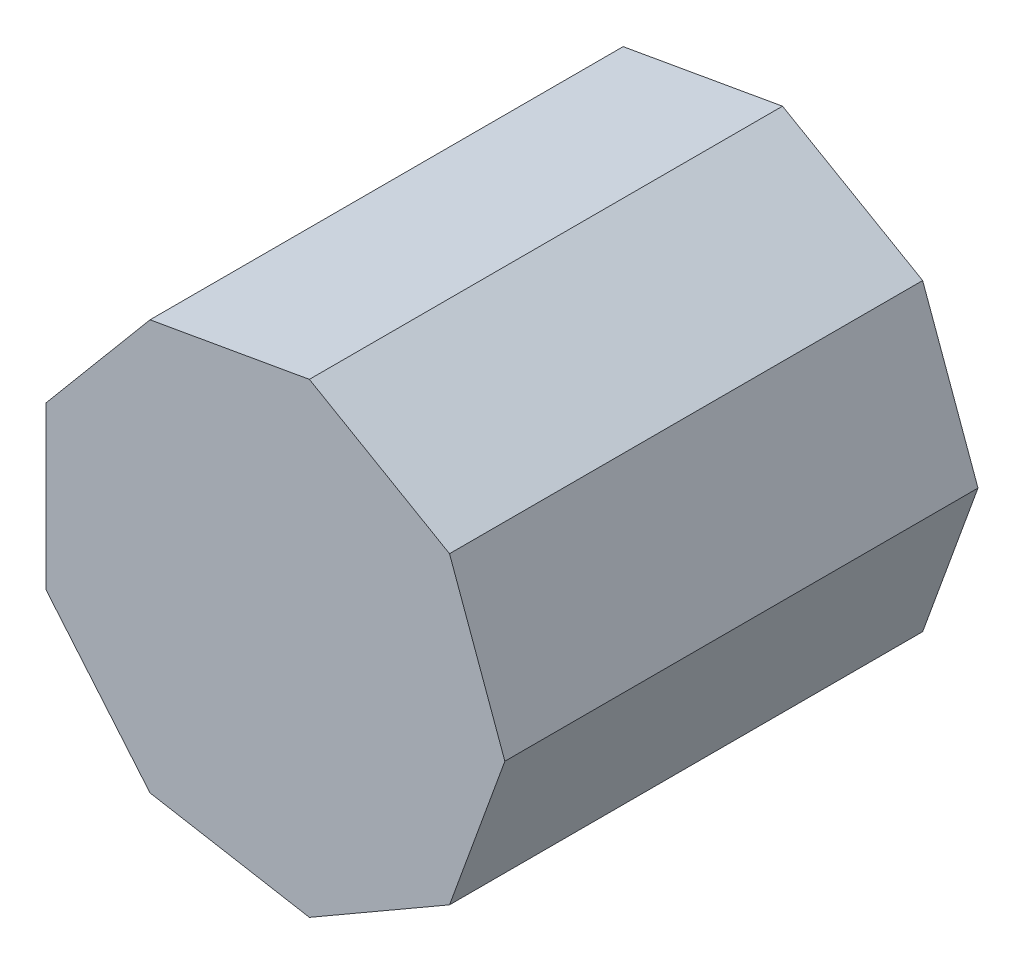
ISO-10303-21;
HEADER;
FILE_DESCRIPTION(('STEP AP214'),'2;1');
FILE_NAME('part.step','',(''),(''),'','','');
FILE_SCHEMA(('AUTOMOTIVE_DESIGN { 1 0 10303 214 1 1 1 1 }'));
ENDSEC;
DATA;
#1=APPLICATION_CONTEXT('core data for automotive mechanical design processes');
#2=APPLICATION_PROTOCOL_DEFINITION('international standard','automotive_design',2000,#1);
#3=PRODUCT_CONTEXT('',#1,'mechanical');
#4=PRODUCT('Part','Part','',(#3));
#5=PRODUCT_RELATED_PRODUCT_CATEGORY('part','',(#4));
#6=PRODUCT_DEFINITION_FORMATION('','',#4);
#7=PRODUCT_DEFINITION_CONTEXT('part definition',#1,'design');
#8=PRODUCT_DEFINITION('design','',#6,#7);
#9=PRODUCT_DEFINITION_SHAPE('','',#8);
#10=(LENGTH_UNIT() NAMED_UNIT(*) SI_UNIT(.MILLI.,.METRE.));
#11=(NAMED_UNIT(*) PLANE_ANGLE_UNIT() SI_UNIT($,.RADIAN.));
#12=(NAMED_UNIT(*) SI_UNIT($,.STERADIAN.) SOLID_ANGLE_UNIT());
#13=UNCERTAINTY_MEASURE_WITH_UNIT(LENGTH_MEASURE(1.E-05),#10,'distance_accuracy_value','');
#14=(GEOMETRIC_REPRESENTATION_CONTEXT(3) GLOBAL_UNCERTAINTY_ASSIGNED_CONTEXT((#13)) GLOBAL_UNIT_ASSIGNED_CONTEXT((#10,
#11,#12)) REPRESENTATION_CONTEXT('',''));
#15=CARTESIAN_POINT('',(0.,0.,0.));
#16=DIRECTION('',(0.,0.,1.));
#17=DIRECTION('',(1.,0.,0.));
#18=AXIS2_PLACEMENT_3D('',#15,#16,#17);
#19=CARTESIAN_POINT('',(-9.39692620785915,3.42020143325668,20.));
#20=DIRECTION('',(-0.766044443118979,0.642787609686538,0.));
#21=DIRECTION('',(-0.642787609686538,-0.766044443118979,0.));
#22=AXIS2_PLACEMENT_3D('',#19,#20,#21);
#23=PLANE('',#22);
#24=DIRECTION('',(0.642787609686538,0.766044443118979,0.));
#25=VECTOR('',#24,1.);
#26=CARTESIAN_POINT('',(-9.39692620785915,3.42020143325668,0.));
#27=LINE('',#26,#25);
#28=CARTESIAN_POINT('',(-9.39692620785915,3.42020143325668,0.));
#29=VERTEX_POINT('',#28);
#30=CARTESIAN_POINT('',(-5.00000000000006,8.6602540378444,0.));
#31=VERTEX_POINT('',#30);
#32=EDGE_CURVE('E136',#29,#31,#27,.T.);
#33=ORIENTED_EDGE('',*,*,#32,.F.);
#34=DIRECTION('',(0.,0.,-1.));
#35=VECTOR('',#34,1.);
#36=CARTESIAN_POINT('',(-9.39692620785915,3.42020143325668,20.));
#37=LINE('',#36,#35);
#38=CARTESIAN_POINT('',(-9.39692620785915,3.42020143325668,20.));
#39=VERTEX_POINT('',#38);
#40=EDGE_CURVE('E11',#39,#29,#37,.T.);
#41=ORIENTED_EDGE('',*,*,#40,.F.);
#42=DIRECTION('',(0.642787609686538,0.766044443118979,0.));
#43=VECTOR('',#42,1.);
#44=CARTESIAN_POINT('',(-9.39692620785915,3.42020143325668,20.));
#45=LINE('',#44,#43);
#46=CARTESIAN_POINT('',(-5.00000000000006,8.6602540378444,20.));
#47=VERTEX_POINT('',#46);
#48=EDGE_CURVE('E159',#39,#47,#45,.T.);
#49=ORIENTED_EDGE('',*,*,#48,.T.);
#50=DIRECTION('',(0.,0.,-1.));
#51=VECTOR('',#50,1.);
#52=CARTESIAN_POINT('',(-5.00000000000006,8.6602540378444,20.));
#53=LINE('',#52,#51);
#54=EDGE_CURVE('E36',#47,#31,#53,.T.);
#55=ORIENTED_EDGE('',*,*,#54,.T.);
#56=EDGE_LOOP('',(#33,#41,#49,#55));
#57=FACE_BOUND('',#56,.T.);
#58=ADVANCED_FACE('F33',(#57),#23,.T.);
#59=CARTESIAN_POINT('',(-9.39692620785914,-3.42020143325671,20.));
#60=DIRECTION('',(-1.,0.,0.));
#61=DIRECTION('',(0.,-1.,0.));
#62=AXIS2_PLACEMENT_3D('',#59,#60,#61);
#63=PLANE('',#62);
#64=DIRECTION('',(0.,1.,0.));
#65=VECTOR('',#64,1.);
#66=CARTESIAN_POINT('',(-9.39692620785914,-3.42020143325671,0.));
#67=LINE('',#66,#65);
#68=CARTESIAN_POINT('',(-9.39692620785914,-3.42020143325671,0.));
#69=VERTEX_POINT('',#68);
#70=EDGE_CURVE('E157',#69,#29,#67,.T.);
#71=ORIENTED_EDGE('',*,*,#70,.F.);
#72=DIRECTION('',(0.,0.,-1.));
#73=VECTOR('',#72,1.);
#74=CARTESIAN_POINT('',(-9.39692620785914,-3.42020143325671,20.));
#75=LINE('',#74,#73);
#76=CARTESIAN_POINT('',(-9.39692620785914,-3.42020143325671,20.));
#77=VERTEX_POINT('',#76);
#78=EDGE_CURVE('E42',#77,#69,#75,.T.);
#79=ORIENTED_EDGE('',*,*,#78,.F.);
#80=DIRECTION('',(0.,1.,0.));
#81=VECTOR('',#80,1.);
#82=CARTESIAN_POINT('',(-9.39692620785914,-3.42020143325671,20.));
#83=LINE('',#82,#81);
#84=EDGE_CURVE('E126',#77,#39,#83,.T.);
#85=ORIENTED_EDGE('',*,*,#84,.T.);
#86=ORIENTED_EDGE('',*,*,#40,.T.);
#87=EDGE_LOOP('',(#71,#79,#85,#86));
#88=FACE_BOUND('',#87,.T.);
#89=ADVANCED_FACE('F173',(#88),#63,.T.);
#90=CARTESIAN_POINT('',(-5.00000000000003,-8.66025403784443,20.));
#91=DIRECTION('',(-0.766044443118977,-0.64278760968654,0.));
#92=DIRECTION('',(0.64278760968654,-0.766044443118978,0.));
#93=AXIS2_PLACEMENT_3D('',#90,#91,#92);
#94=PLANE('',#93);
#95=DIRECTION('',(-0.64278760968654,0.766044443118977,0.));
#96=VECTOR('',#95,1.);
#97=CARTESIAN_POINT('',(-5.00000000000003,-8.66025403784443,0.));
#98=LINE('',#97,#96);
#99=CARTESIAN_POINT('',(-5.00000000000003,-8.66025403784443,0.));
#100=VERTEX_POINT('',#99);
#101=EDGE_CURVE('E113',#100,#69,#98,.T.);
#102=ORIENTED_EDGE('',*,*,#101,.F.);
#103=DIRECTION('',(0.,0.,-1.));
#104=VECTOR('',#103,1.);
#105=CARTESIAN_POINT('',(-5.00000000000003,-8.66025403784443,20.));
#106=LINE('',#105,#104);
#107=CARTESIAN_POINT('',(-5.00000000000003,-8.66025403784443,20.));
#108=VERTEX_POINT('',#107);
#109=EDGE_CURVE('E108',#108,#100,#106,.T.);
#110=ORIENTED_EDGE('',*,*,#109,.F.);
#111=DIRECTION('',(-0.64278760968654,0.766044443118977,0.));
#112=VECTOR('',#111,1.);
#113=CARTESIAN_POINT('',(-5.00000000000003,-8.66025403784443,20.));
#114=LINE('',#113,#112);
#115=EDGE_CURVE('E111',#108,#77,#114,.T.);
#116=ORIENTED_EDGE('',*,*,#115,.T.);
#117=ORIENTED_EDGE('',*,*,#78,.T.);
#118=EDGE_LOOP('',(#102,#110,#116,#117));
#119=FACE_BOUND('',#118,.T.);
#120=ADVANCED_FACE('F110',(#119),#94,.T.);
#121=CARTESIAN_POINT('',(1.73648177666929,-9.84807753012212,20.));
#122=DIRECTION('',(-0.173648177666929,-0.984807753012208,0.));
#123=DIRECTION('',(0.984807753012208,-0.173648177666929,0.));
#124=AXIS2_PLACEMENT_3D('',#121,#122,#123);
#125=PLANE('',#124);
#126=DIRECTION('',(-0.984807753012208,0.173648177666929,0.));
#127=VECTOR('',#126,1.);
#128=CARTESIAN_POINT('',(1.73648177666929,-9.84807753012212,0.));
#129=LINE('',#128,#127);
#130=CARTESIAN_POINT('',(1.73648177666929,-9.84807753012212,0.));
#131=VERTEX_POINT('',#130);
#132=EDGE_CURVE('E154',#131,#100,#129,.T.);
#133=ORIENTED_EDGE('',*,*,#132,.F.);
#134=DIRECTION('',(0.,0.,-1.));
#135=VECTOR('',#134,1.);
#136=CARTESIAN_POINT('',(1.73648177666929,-9.84807753012212,20.));
#137=LINE('',#136,#135);
#138=CARTESIAN_POINT('',(1.73648177666929,-9.84807753012212,20.));
#139=VERTEX_POINT('',#138);
#140=EDGE_CURVE('E118',#139,#131,#137,.T.);
#141=ORIENTED_EDGE('',*,*,#140,.F.);
#142=DIRECTION('',(-0.984807753012208,0.173648177666929,0.));
#143=VECTOR('',#142,1.);
#144=CARTESIAN_POINT('',(1.73648177666929,-9.84807753012212,20.));
#145=LINE('',#144,#143);
#146=EDGE_CURVE('E124',#139,#108,#145,.T.);
#147=ORIENTED_EDGE('',*,*,#146,.T.);
#148=ORIENTED_EDGE('',*,*,#109,.T.);
#149=EDGE_LOOP('',(#133,#141,#147,#148));
#150=FACE_BOUND('',#149,.T.);
#151=ADVANCED_FACE('F128',(#150),#125,.T.);
#152=CARTESIAN_POINT('',(7.66044443118978,-6.42787609686541,20.));
#153=DIRECTION('',(0.500000000000001,-0.866025403784438,0.));
#154=DIRECTION('',(0.866025403784438,0.500000000000001,0.));
#155=AXIS2_PLACEMENT_3D('',#152,#153,#154);
#156=PLANE('',#155);
#157=DIRECTION('',(-0.866025403784438,-0.500000000000001,0.));
#158=VECTOR('',#157,1.);
#159=CARTESIAN_POINT('',(7.66044443118978,-6.42787609686541,0.));
#160=LINE('',#159,#158);
#161=CARTESIAN_POINT('',(7.66044443118978,-6.42787609686541,0.));
#162=VERTEX_POINT('',#161);
#163=EDGE_CURVE('E151',#162,#131,#160,.T.);
#164=ORIENTED_EDGE('',*,*,#163,.F.);
#165=DIRECTION('',(0.,0.,-1.));
#166=VECTOR('',#165,1.);
#167=CARTESIAN_POINT('',(7.66044443118978,-6.42787609686541,20.));
#168=LINE('',#167,#166);
#169=CARTESIAN_POINT('',(7.66044443118978,-6.42787609686541,20.));
#170=VERTEX_POINT('',#169);
#171=EDGE_CURVE('E163',#170,#162,#168,.T.);
#172=ORIENTED_EDGE('',*,*,#171,.F.);
#173=DIRECTION('',(-0.866025403784438,-0.500000000000001,0.));
#174=VECTOR('',#173,1.);
#175=CARTESIAN_POINT('',(7.66044443118978,-6.42787609686541,20.));
#176=LINE('',#175,#174);
#177=EDGE_CURVE('E129',#170,#139,#176,.T.);
#178=ORIENTED_EDGE('',*,*,#177,.T.);
#179=ORIENTED_EDGE('',*,*,#140,.T.);
#180=EDGE_LOOP('',(#164,#172,#178,#179));
#181=FACE_BOUND('',#180,.T.);
#182=ADVANCED_FACE('F186',(#181),#156,.T.);
#183=CARTESIAN_POINT('',(10.,0.,20.));
#184=DIRECTION('',(0.939692620785908,-0.342020143325669,0.));
#185=DIRECTION('',(0.342020143325669,0.939692620785908,0.));
#186=AXIS2_PLACEMENT_3D('',#183,#184,#185);
#187=PLANE('',#186);
#188=DIRECTION('',(-0.342020143325669,-0.939692620785908,0.));
#189=VECTOR('',#188,1.);
#190=CARTESIAN_POINT('',(10.,0.,0.));
#191=LINE('',#190,#189);
#192=CARTESIAN_POINT('',(10.,0.,0.));
#193=VERTEX_POINT('',#192);
#194=EDGE_CURVE('E148',#193,#162,#191,.T.);
#195=ORIENTED_EDGE('',*,*,#194,.F.);
#196=DIRECTION('',(0.,0.,-1.));
#197=VECTOR('',#196,1.);
#198=CARTESIAN_POINT('',(10.,0.,20.));
#199=LINE('',#198,#197);
#200=CARTESIAN_POINT('',(10.,0.,20.));
#201=VERTEX_POINT('',#200);
#202=EDGE_CURVE('E165',#201,#193,#199,.T.);
#203=ORIENTED_EDGE('',*,*,#202,.F.);
#204=DIRECTION('',(-0.342020143325669,-0.939692620785908,0.));
#205=VECTOR('',#204,1.);
#206=CARTESIAN_POINT('',(10.,0.,20.));
#207=LINE('',#206,#205);
#208=EDGE_CURVE('E131',#201,#170,#207,.T.);
#209=ORIENTED_EDGE('',*,*,#208,.T.);
#210=ORIENTED_EDGE('',*,*,#171,.T.);
#211=EDGE_LOOP('',(#195,#203,#209,#210));
#212=FACE_BOUND('',#211,.T.);
#213=ADVANCED_FACE('F189',(#212),#187,.T.);
#214=CARTESIAN_POINT('',(7.66044443118977,6.42787609686541,20.));
#215=DIRECTION('',(0.939692620785908,0.342020143325671,0.));
#216=DIRECTION('',(-0.342020143325671,0.939692620785908,0.));
#217=AXIS2_PLACEMENT_3D('',#214,#215,#216);
#218=PLANE('',#217);
#219=DIRECTION('',(0.342020143325671,-0.939692620785908,0.));
#220=VECTOR('',#219,1.);
#221=CARTESIAN_POINT('',(7.66044443118977,6.42787609686541,0.));
#222=LINE('',#221,#220);
#223=CARTESIAN_POINT('',(7.66044443118977,6.42787609686541,0.));
#224=VERTEX_POINT('',#223);
#225=EDGE_CURVE('E145',#224,#193,#222,.T.);
#226=ORIENTED_EDGE('',*,*,#225,.F.);
#227=DIRECTION('',(0.,0.,-1.));
#228=VECTOR('',#227,1.);
#229=CARTESIAN_POINT('',(7.66044443118977,6.42787609686541,20.));
#230=LINE('',#229,#228);
#231=CARTESIAN_POINT('',(7.66044443118977,6.42787609686541,20.));
#232=VERTEX_POINT('',#231);
#233=EDGE_CURVE('E167',#232,#224,#230,.T.);
#234=ORIENTED_EDGE('',*,*,#233,.F.);
#235=DIRECTION('',(0.342020143325671,-0.939692620785908,0.));
#236=VECTOR('',#235,1.);
#237=CARTESIAN_POINT('',(7.66044443118977,6.42787609686541,20.));
#238=LINE('',#237,#236);
#239=EDGE_CURVE('E274',#232,#201,#238,.T.);
#240=ORIENTED_EDGE('',*,*,#239,.T.);
#241=ORIENTED_EDGE('',*,*,#202,.T.);
#242=EDGE_LOOP('',(#226,#234,#240,#241));
#243=FACE_BOUND('',#242,.T.);
#244=ADVANCED_FACE('F193',(#243),#218,.T.);
#245=CARTESIAN_POINT('',(1.73648177666927,9.8480775301221,20.));
#246=DIRECTION('',(0.5,0.866025403784439,0.));
#247=DIRECTION('',(-0.866025403784439,0.5,0.));
#248=AXIS2_PLACEMENT_3D('',#245,#246,#247);
#249=PLANE('',#248);
#250=DIRECTION('',(0.866025403784439,-0.5,0.));
#251=VECTOR('',#250,1.);
#252=CARTESIAN_POINT('',(1.73648177666927,9.8480775301221,0.));
#253=LINE('',#252,#251);
#254=CARTESIAN_POINT('',(1.73648177666927,9.8480775301221,0.));
#255=VERTEX_POINT('',#254);
#256=EDGE_CURVE('E142',#255,#224,#253,.T.);
#257=ORIENTED_EDGE('',*,*,#256,.F.);
#258=DIRECTION('',(0.,0.,-1.));
#259=VECTOR('',#258,1.);
#260=CARTESIAN_POINT('',(1.73648177666927,9.8480775301221,20.));
#261=LINE('',#260,#259);
#262=CARTESIAN_POINT('',(1.73648177666927,9.8480775301221,20.));
#263=VERTEX_POINT('',#262);
#264=EDGE_CURVE('E168',#263,#255,#261,.T.);
#265=ORIENTED_EDGE('',*,*,#264,.F.);
#266=DIRECTION('',(0.866025403784439,-0.5,0.));
#267=VECTOR('',#266,1.);
#268=CARTESIAN_POINT('',(1.73648177666927,9.8480775301221,20.));
#269=LINE('',#268,#267);
#270=EDGE_CURVE('E278',#263,#232,#269,.T.);
#271=ORIENTED_EDGE('',*,*,#270,.T.);
#272=ORIENTED_EDGE('',*,*,#233,.T.);
#273=EDGE_LOOP('',(#257,#265,#271,#272));
#274=FACE_BOUND('',#273,.T.);
#275=ADVANCED_FACE('F197',(#274),#249,.T.);
#276=CARTESIAN_POINT('',(-5.00000000000006,8.6602540378444,20.));
#277=DIRECTION('',(-0.173648177666932,0.984807753012208,0.));
#278=DIRECTION('',(-0.984807753012208,-0.173648177666932,0.));
#279=AXIS2_PLACEMENT_3D('',#276,#277,#278);
#280=PLANE('',#279);
#281=DIRECTION('',(0.984807753012208,0.173648177666932,0.));
#282=VECTOR('',#281,1.);
#283=CARTESIAN_POINT('',(-5.00000000000006,8.6602540378444,0.));
#284=LINE('',#283,#282);
#285=EDGE_CURVE('E139',#31,#255,#284,.T.);
#286=ORIENTED_EDGE('',*,*,#285,.F.);
#287=ORIENTED_EDGE('',*,*,#54,.F.);
#288=DIRECTION('',(0.984807753012208,0.173648177666932,0.));
#289=VECTOR('',#288,1.);
#290=CARTESIAN_POINT('',(-5.00000000000006,8.6602540378444,20.));
#291=LINE('',#290,#289);
#292=EDGE_CURVE('E282',#47,#263,#291,.T.);
#293=ORIENTED_EDGE('',*,*,#292,.T.);
#294=ORIENTED_EDGE('',*,*,#264,.T.);
#295=EDGE_LOOP('',(#286,#287,#293,#294));
#296=FACE_BOUND('',#295,.T.);
#297=ADVANCED_FACE('F170',(#296),#280,.T.);
#298=CARTESIAN_POINT('',(0.,0.,20.));
#299=DIRECTION('',(0.,0.,-1.));
#300=DIRECTION('',(-1.,0.,0.));
#301=AXIS2_PLACEMENT_3D('',#298,#299,#300);
#302=PLANE('',#301);
#303=ORIENTED_EDGE('',*,*,#48,.F.);
#304=ORIENTED_EDGE('',*,*,#84,.F.);
#305=ORIENTED_EDGE('',*,*,#115,.F.);
#306=ORIENTED_EDGE('',*,*,#146,.F.);
#307=ORIENTED_EDGE('',*,*,#177,.F.);
#308=ORIENTED_EDGE('',*,*,#208,.F.);
#309=ORIENTED_EDGE('',*,*,#239,.F.);
#310=ORIENTED_EDGE('',*,*,#270,.F.);
#311=ORIENTED_EDGE('',*,*,#292,.F.);
#312=EDGE_LOOP('',(#303,#304,#305,#306,#307,#308,#309,#310,#311));
#313=FACE_BOUND('',#312,.T.);
#314=ADVANCED_FACE('F122',(#313),#302,.F.);
#315=CARTESIAN_POINT('',(0.,0.,0.));
#316=DIRECTION('',(0.,0.,-1.));
#317=DIRECTION('',(-1.,0.,0.));
#318=AXIS2_PLACEMENT_3D('',#315,#316,#317);
#319=PLANE('',#318);
#320=ORIENTED_EDGE('',*,*,#32,.T.);
#321=ORIENTED_EDGE('',*,*,#285,.T.);
#322=ORIENTED_EDGE('',*,*,#256,.T.);
#323=ORIENTED_EDGE('',*,*,#225,.T.);
#324=ORIENTED_EDGE('',*,*,#194,.T.);
#325=ORIENTED_EDGE('',*,*,#163,.T.);
#326=ORIENTED_EDGE('',*,*,#132,.T.);
#327=ORIENTED_EDGE('',*,*,#101,.T.);
#328=ORIENTED_EDGE('',*,*,#70,.T.);
#329=EDGE_LOOP('',(#320,#321,#322,#323,#324,#325,#326,#327,#328));
#330=FACE_BOUND('',#329,.T.);
#331=ADVANCED_FACE('F172',(#330),#319,.T.);
#332=CLOSED_SHELL('',(#58,#89,#120,#151,#182,#213,#244,#275,#297,#314,#331));
#333=MANIFOLD_SOLID_BREP('B2',#332);
#334=ADVANCED_BREP_SHAPE_REPRESENTATION('',(#18,#333),#14);
#335=SHAPE_DEFINITION_REPRESENTATION(#9,#334);
ENDSEC;
END-ISO-10303-21;
